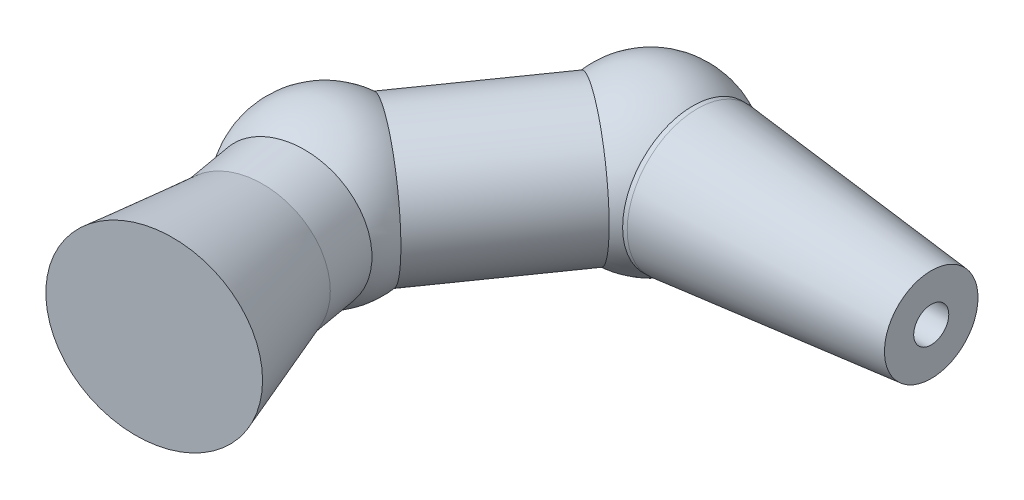
ISO-10303-21;
HEADER;
FILE_DESCRIPTION(('STEP AP214'),'2;1');
FILE_NAME('part.step','',(''),(''),'','','');
FILE_SCHEMA(('AUTOMOTIVE_DESIGN { 1 0 10303 214 1 1 1 1 }'));
ENDSEC;
DATA;
#1=APPLICATION_CONTEXT('core data for automotive mechanical design processes');
#2=APPLICATION_PROTOCOL_DEFINITION('international standard','automotive_design',2000,#1);
#3=PRODUCT_CONTEXT('',#1,'mechanical');
#4=PRODUCT('Part','Part','',(#3));
#5=PRODUCT_RELATED_PRODUCT_CATEGORY('part','',(#4));
#6=PRODUCT_DEFINITION_FORMATION('','',#4);
#7=PRODUCT_DEFINITION_CONTEXT('part definition',#1,'design');
#8=PRODUCT_DEFINITION('design','',#6,#7);
#9=PRODUCT_DEFINITION_SHAPE('','',#8);
#10=(LENGTH_UNIT() NAMED_UNIT(*) SI_UNIT(.MILLI.,.METRE.));
#11=(NAMED_UNIT(*) PLANE_ANGLE_UNIT() SI_UNIT($,.RADIAN.));
#12=(NAMED_UNIT(*) SI_UNIT($,.STERADIAN.) SOLID_ANGLE_UNIT());
#13=UNCERTAINTY_MEASURE_WITH_UNIT(LENGTH_MEASURE(1.E-05),#10,'distance_accuracy_value','');
#14=(GEOMETRIC_REPRESENTATION_CONTEXT(3) GLOBAL_UNCERTAINTY_ASSIGNED_CONTEXT((#13)) GLOBAL_UNIT_ASSIGNED_CONTEXT((#10,
#11,#12)) REPRESENTATION_CONTEXT('',''));
#15=CARTESIAN_POINT('',(0.,0.,0.));
#16=DIRECTION('',(0.,0.,1.));
#17=DIRECTION('',(1.,0.,0.));
#18=AXIS2_PLACEMENT_3D('',#15,#16,#17);
#19=CARTESIAN_POINT('',(-5.73576436351044,0.,8.19152044288994));
#20=DIRECTION('',(0.,-1.,0.));
#21=DIRECTION('',(-0.819152044288993,0.,-0.573576436351044));
#22=AXIS2_PLACEMENT_3D('',#19,#20,#21);
#23=SPHERICAL_SURFACE('',#22,3.5);
#24=CARTESIAN_POINT('',(-4.70173473767965,0.,6.71477309384738));
#25=DIRECTION('',(-0.573576436351044,0.,0.819152044288993));
#26=DIRECTION('',(0.819152044288993,0.,0.573576436351044));
#27=AXIS2_PLACEMENT_3D('',#24,#25,#26);
#28=CIRCLE('',#27,3.);
#29=CARTESIAN_POINT('',(-2.24427860481267,0.,8.43550240290051));
#30=VERTEX_POINT('',#29);
#31=EDGE_CURVE('E38',#30,#30,#28,.T.);
#32=ORIENTED_EDGE('',*,*,#31,.T.);
#33=EDGE_LOOP('',(#32));
#34=FACE_BOUND('',#33,.T.);
#35=CARTESIAN_POINT('',(-5.42271565927594,0.,9.96690786786993));
#36=DIRECTION('',(-0.173648177666934,0.,-0.984807753012207));
#37=DIRECTION('',(-0.984807753012208,0.,0.173648177666934));
#38=AXIS2_PLACEMENT_3D('',#35,#36,#37);
#39=CIRCLE('',#38,3.);
#40=CARTESIAN_POINT('',(-8.37713891831256,0.,10.4878524008707));
#41=VERTEX_POINT('',#40);
#42=EDGE_CURVE('E10',#41,#41,#39,.F.);
#43=ORIENTED_EDGE('',*,*,#42,.F.);
#44=EDGE_LOOP('',(#43));
#45=FACE_BOUND('',#44,.T.);
#46=ADVANCED_FACE('F31',(#34,#45),#23,.T.);
#47=CARTESIAN_POINT('',(-5.73576436351044,0.,8.19152044288993));
#48=DIRECTION('',(0.573576436351044,0.,-0.819152044288993));
#49=DIRECTION('',(-0.819152044288993,0.,-0.573576436351044));
#50=AXIS2_PLACEMENT_3D('',#47,#48,#49);
#51=CYLINDRICAL_SURFACE('',#50,3.);
#52=CARTESIAN_POINT('',(-1.0340296258308,0.,1.47674734904256));
#53=DIRECTION('',(0.573576436351044,0.,-0.819152044288993));
#54=DIRECTION('',(-0.819152044288993,0.,-0.573576436351044));
#55=AXIS2_PLACEMENT_3D('',#52,#53,#54);
#56=CIRCLE('',#55,3.);
#57=CARTESIAN_POINT('',(-3.49148575869778,0.,-0.243981960010574));
#58=VERTEX_POINT('',#57);
#59=EDGE_CURVE('E49',#58,#58,#56,.T.);
#60=ORIENTED_EDGE('',*,*,#59,.F.);
#61=EDGE_LOOP('',(#60));
#62=FACE_BOUND('',#61,.T.);
#63=ORIENTED_EDGE('',*,*,#31,.F.);
#64=EDGE_LOOP('',(#63));
#65=FACE_BOUND('',#64,.T.);
#66=ADVANCED_FACE('F80',(#62,#65),#51,.T.);
#67=CARTESIAN_POINT('',(0.,0.,0.));
#68=DIRECTION('',(0.,1.,0.));
#69=DIRECTION('',(0.,0.,1.));
#70=AXIS2_PLACEMENT_3D('',#67,#68,#69);
#71=SPHERICAL_SURFACE('',#70,3.5);
#72=CARTESIAN_POINT('',(1.80277563773199,0.,0.));
#73=DIRECTION('',(-1.,0.,0.));
#74=DIRECTION('',(0.,0.,1.));
#75=AXIS2_PLACEMENT_3D('',#72,#73,#74);
#76=CIRCLE('',#75,3.);
#77=CARTESIAN_POINT('',(1.80277563773199,0.,3.));
#78=VERTEX_POINT('',#77);
#79=EDGE_CURVE('E51',#78,#78,#76,.F.);
#80=ORIENTED_EDGE('',*,*,#79,.F.);
#81=EDGE_LOOP('',(#80));
#82=FACE_BOUND('',#81,.T.);
#83=ORIENTED_EDGE('',*,*,#59,.T.);
#84=EDGE_LOOP('',(#83));
#85=FACE_BOUND('',#84,.T.);
#86=ADVANCED_FACE('F85',(#82,#85),#71,.T.);
#87=CARTESIAN_POINT('',(12.,0.,0.));
#88=DIRECTION('',(1.,0.,0.));
#89=DIRECTION('',(0.,0.,-1.));
#90=AXIS2_PLACEMENT_3D('',#87,#88,#89);
#91=PLANE('',#90);
#92=CARTESIAN_POINT('',(12.,0.,0.));
#93=DIRECTION('',(1.,0.,0.));
#94=DIRECTION('',(0.,0.,-1.));
#95=AXIS2_PLACEMENT_3D('',#92,#93,#94);
#96=CIRCLE('',#95,1.99999999999999);
#97=CARTESIAN_POINT('',(12.,0.,-1.99999999999999));
#98=VERTEX_POINT('',#97);
#99=EDGE_CURVE('E56',#98,#98,#96,.T.);
#100=ORIENTED_EDGE('',*,*,#99,.T.);
#101=EDGE_LOOP('',(#100));
#102=FACE_BOUND('',#101,.T.);
#103=CARTESIAN_POINT('',(12.,0.,0.));
#104=DIRECTION('',(1.,0.,0.));
#105=DIRECTION('',(0.,0.,-1.));
#106=AXIS2_PLACEMENT_3D('',#103,#104,#105);
#107=CIRCLE('',#106,0.75);
#108=CARTESIAN_POINT('',(12.,0.,-0.75));
#109=VERTEX_POINT('',#108);
#110=EDGE_CURVE('E59',#109,#109,#107,.T.);
#111=ORIENTED_EDGE('',*,*,#110,.F.);
#112=EDGE_LOOP('',(#111));
#113=FACE_BOUND('',#112,.T.);
#114=ADVANCED_FACE('F101',(#102,#113),#91,.T.);
#115=CARTESIAN_POINT('',(12.,0.,0.));
#116=DIRECTION('',(-1.,0.,0.));
#117=DIRECTION('',(0.,0.,1.));
#118=AXIS2_PLACEMENT_3D('',#115,#116,#117);
#119=CYLINDRICAL_SURFACE('',#118,3.);
#120=ORIENTED_EDGE('',*,*,#79,.T.);
#121=EDGE_LOOP('',(#120));
#122=FACE_BOUND('',#121,.T.);
#123=CARTESIAN_POINT('',(1.99999999999954,0.,0.));
#124=DIRECTION('',(1.,0.,0.));
#125=DIRECTION('',(0.,0.,-1.));
#126=AXIS2_PLACEMENT_3D('',#123,#124,#125);
#127=CIRCLE('',#126,3.);
#128=CARTESIAN_POINT('',(1.99999999999954,0.,-3.));
#129=VERTEX_POINT('',#128);
#130=EDGE_CURVE('E46',#129,#129,#127,.F.);
#131=ORIENTED_EDGE('',*,*,#130,.T.);
#132=EDGE_LOOP('',(#131));
#133=FACE_BOUND('',#132,.T.);
#134=ADVANCED_FACE('F99',(#122,#133),#119,.T.);
#135=CARTESIAN_POINT('',(12.,0.,0.));
#136=DIRECTION('',(-1.,0.,0.));
#137=DIRECTION('',(0.,0.,1.));
#138=AXIS2_PLACEMENT_3D('',#135,#136,#137);
#139=CYLINDRICAL_SURFACE('',#138,0.75);
#140=CARTESIAN_POINT('',(3.41869858279434,0.,0.));
#141=DIRECTION('',(-1.,0.,0.));
#142=DIRECTION('',(0.,0.,1.));
#143=AXIS2_PLACEMENT_3D('',#140,#141,#142);
#144=CIRCLE('',#143,0.75);
#145=CARTESIAN_POINT('',(3.41869858279434,0.,0.75));
#146=VERTEX_POINT('',#145);
#147=EDGE_CURVE('E42',#146,#146,#144,.F.);
#148=ORIENTED_EDGE('',*,*,#147,.F.);
#149=EDGE_LOOP('',(#148));
#150=FACE_BOUND('',#149,.T.);
#151=ORIENTED_EDGE('',*,*,#110,.T.);
#152=EDGE_LOOP('',(#151));
#153=FACE_BOUND('',#152,.T.);
#154=ADVANCED_FACE('F96',(#150,#153),#139,.F.);
#155=CARTESIAN_POINT('',(12.,0.,0.));
#156=DIRECTION('',(-1.,0.,0.));
#157=DIRECTION('',(0.,0.,1.));
#158=AXIS2_PLACEMENT_3D('',#155,#156,#157);
#159=CONICAL_SURFACE('',#158,1.99999999999999,0.0996686524911586);
#160=ORIENTED_EDGE('',*,*,#130,.F.);
#161=EDGE_LOOP('',(#160));
#162=FACE_BOUND('',#161,.T.);
#163=ORIENTED_EDGE('',*,*,#99,.F.);
#164=EDGE_LOOP('',(#163));
#165=FACE_BOUND('',#164,.T.);
#166=ADVANCED_FACE('F94',(#162,#165),#159,.T.);
#167=CARTESIAN_POINT('',(0.,0.,0.));
#168=DIRECTION('',(-1.,0.,0.));
#169=DIRECTION('',(0.,0.,1.));
#170=AXIS2_PLACEMENT_3D('',#167,#168,#169);
#171=SPHERICAL_SURFACE('',#170,3.5);
#172=ORIENTED_EDGE('',*,*,#147,.T.);
#173=EDGE_LOOP('',(#172));
#174=FACE_BOUND('',#173,.T.);
#175=ADVANCED_FACE('F91',(#174),#171,.T.);
#176=CARTESIAN_POINT('',(-5.0411716528427,0.,12.1307514549388));
#177=DIRECTION('',(-0.173648177666934,0.,-0.984807753012207));
#178=DIRECTION('',(-0.984807753012208,0.,0.173648177666934));
#179=AXIS2_PLACEMENT_3D('',#176,#177,#178);
#180=CYLINDRICAL_SURFACE('',#179,3.);
#181=CARTESIAN_POINT('',(-5.0411716528427,0.,12.1307514549388));
#182=DIRECTION('',(0.173648177666934,0.,0.984807753012207));
#183=DIRECTION('',(0.984807753012207,0.,-0.173648177666934));
#184=AXIS2_PLACEMENT_3D('',#181,#182,#183);
#185=CIRCLE('',#184,3.);
#186=CARTESIAN_POINT('',(-2.08674839380608,0.,11.609806921938));
#187=VERTEX_POINT('',#186);
#188=EDGE_CURVE('E52',#187,#187,#185,.T.);
#189=ORIENTED_EDGE('',*,*,#188,.F.);
#190=EDGE_LOOP('',(#189));
#191=FACE_BOUND('',#190,.T.);
#192=ORIENTED_EDGE('',*,*,#42,.T.);
#193=EDGE_LOOP('',(#192));
#194=FACE_BOUND('',#193,.T.);
#195=ADVANCED_FACE('F77',(#191,#194),#180,.T.);
#196=CARTESIAN_POINT('',(-4.17293076450803,0.,17.0547902199998));
#197=DIRECTION('',(0.173648177666934,0.,0.984807753012207));
#198=DIRECTION('',(0.984807753012207,0.,-0.173648177666934));
#199=AXIS2_PLACEMENT_3D('',#196,#197,#198);
#200=PLANE('',#199);
#201=CARTESIAN_POINT('',(-4.17293076450803,0.,17.0547902199998));
#202=DIRECTION('',(0.173648177666934,0.,0.984807753012207));
#203=DIRECTION('',(0.984807753012207,0.,-0.173648177666934));
#204=AXIS2_PLACEMENT_3D('',#201,#202,#203);
#205=CIRCLE('',#204,4.);
#206=CARTESIAN_POINT('',(-0.233699752459204,0.,16.3601975093321));
#207=VERTEX_POINT('',#206);
#208=EDGE_CURVE('E66',#207,#207,#205,.T.);
#209=ORIENTED_EDGE('',*,*,#208,.T.);
#210=EDGE_LOOP('',(#209));
#211=FACE_BOUND('',#210,.T.);
#212=ADVANCED_FACE('F70',(#211),#200,.T.);
#213=CARTESIAN_POINT('',(-4.17293076450802,0.,17.0547902199999));
#214=DIRECTION('',(0.173648177666934,0.,0.984807753012207));
#215=DIRECTION('',(0.984807753012208,0.,-0.173648177666934));
#216=AXIS2_PLACEMENT_3D('',#213,#214,#215);
#217=CONICAL_SURFACE('',#216,4.,0.197395559849878);
#218=ORIENTED_EDGE('',*,*,#188,.T.);
#219=EDGE_LOOP('',(#218));
#220=FACE_BOUND('',#219,.T.);
#221=ORIENTED_EDGE('',*,*,#208,.F.);
#222=EDGE_LOOP('',(#221));
#223=FACE_BOUND('',#222,.T.);
#224=ADVANCED_FACE('F33',(#220,#223),#217,.T.);
#225=CLOSED_SHELL('',(#46,#66,#86,#114,#134,#154,#166,#175,#195,#212,#224));
#226=MANIFOLD_SOLID_BREP('B2',#225);
#227=ADVANCED_BREP_SHAPE_REPRESENTATION('',(#18,#226),#14);
#228=SHAPE_DEFINITION_REPRESENTATION(#9,#227);
ENDSEC;
END-ISO-10303-21;
